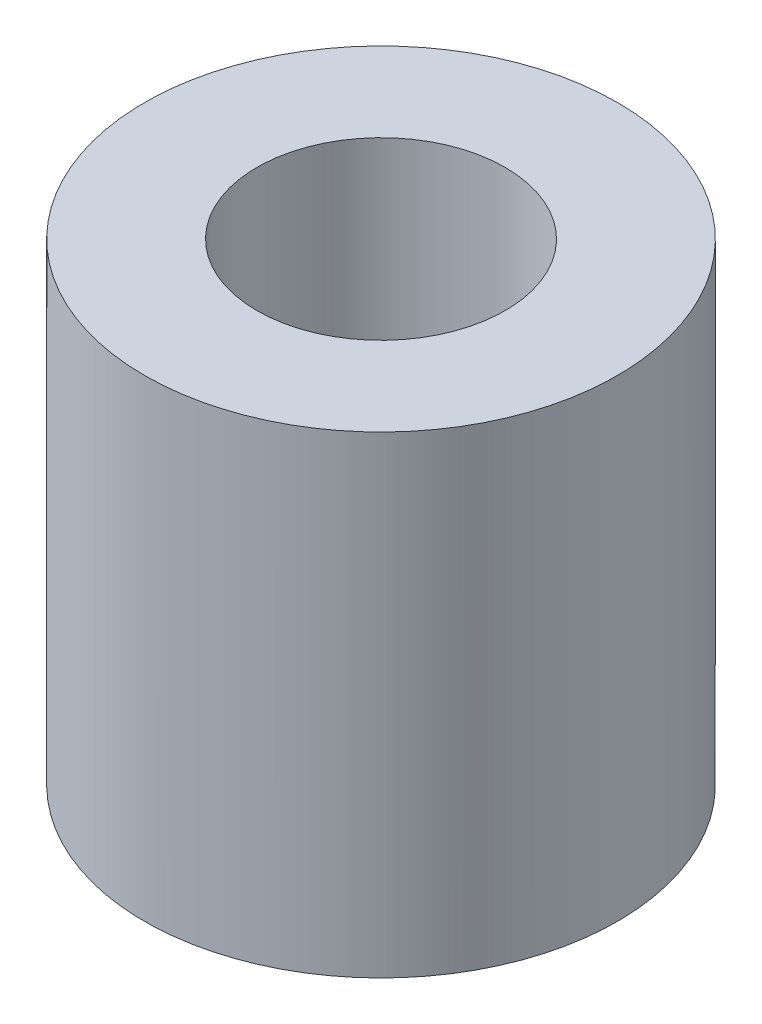
ISO-10303-21;
HEADER;
FILE_DESCRIPTION(('STEP AP214'),'2;1');
FILE_NAME('part.step','',(''),(''),'','','');
FILE_SCHEMA(('AUTOMOTIVE_DESIGN { 1 0 10303 214 1 1 1 1 }'));
ENDSEC;
DATA;
#1=APPLICATION_CONTEXT('core data for automotive mechanical design processes');
#2=APPLICATION_PROTOCOL_DEFINITION('international standard','automotive_design',2000,#1);
#3=PRODUCT_CONTEXT('',#1,'mechanical');
#4=PRODUCT('Part','Part','',(#3));
#5=PRODUCT_RELATED_PRODUCT_CATEGORY('part','',(#4));
#6=PRODUCT_DEFINITION_FORMATION('','',#4);
#7=PRODUCT_DEFINITION_CONTEXT('part definition',#1,'design');
#8=PRODUCT_DEFINITION('design','',#6,#7);
#9=PRODUCT_DEFINITION_SHAPE('','',#8);
#10=(LENGTH_UNIT() NAMED_UNIT(*) SI_UNIT(.MILLI.,.METRE.));
#11=(NAMED_UNIT(*) PLANE_ANGLE_UNIT() SI_UNIT($,.RADIAN.));
#12=(NAMED_UNIT(*) SI_UNIT($,.STERADIAN.) SOLID_ANGLE_UNIT());
#13=UNCERTAINTY_MEASURE_WITH_UNIT(LENGTH_MEASURE(1.E-05),#10,'distance_accuracy_value','');
#14=(GEOMETRIC_REPRESENTATION_CONTEXT(3) GLOBAL_UNCERTAINTY_ASSIGNED_CONTEXT((#13)) GLOBAL_UNIT_ASSIGNED_CONTEXT((#10,
#11,#12)) REPRESENTATION_CONTEXT('',''));
#15=CARTESIAN_POINT('',(0.,0.,0.));
#16=DIRECTION('',(0.,0.,1.));
#17=DIRECTION('',(1.,0.,0.));
#18=AXIS2_PLACEMENT_3D('',#15,#16,#17);
#19=CARTESIAN_POINT('',(0.,12.7,0.));
#20=DIRECTION('',(0.,1.,0.));
#21=DIRECTION('',(0.,0.,1.));
#22=AXIS2_PLACEMENT_3D('',#19,#20,#21);
#23=PLANE('',#22);
#24=CARTESIAN_POINT('',(0.,12.7,0.));
#25=DIRECTION('',(0.,1.,0.));
#26=DIRECTION('',(0.,0.,1.));
#27=AXIS2_PLACEMENT_3D('',#24,#25,#26);
#28=CIRCLE('',#27,7.62);
#29=CARTESIAN_POINT('',(0.,12.7,7.62));
#30=VERTEX_POINT('',#29);
#31=EDGE_CURVE('E10',#30,#30,#28,.T.);
#32=ORIENTED_EDGE('',*,*,#31,.T.);
#33=EDGE_LOOP('',(#32));
#34=FACE_BOUND('',#33,.T.);
#35=CARTESIAN_POINT('',(0.,12.7,0.));
#36=DIRECTION('',(0.,1.,0.));
#37=DIRECTION('',(0.,0.,1.));
#38=AXIS2_PLACEMENT_3D('',#35,#36,#37);
#39=CIRCLE('',#38,4.0005);
#40=CARTESIAN_POINT('',(0.,12.7,4.0005));
#41=VERTEX_POINT('',#40);
#42=EDGE_CURVE('E37',#41,#41,#39,.T.);
#43=ORIENTED_EDGE('',*,*,#42,.F.);
#44=EDGE_LOOP('',(#43));
#45=FACE_BOUND('',#44,.T.);
#46=ADVANCED_FACE('F30',(#34,#45),#23,.T.);
#47=CARTESIAN_POINT('',(0.,12.7,0.));
#48=DIRECTION('',(0.,-1.,0.));
#49=DIRECTION('',(0.,0.,-1.));
#50=AXIS2_PLACEMENT_3D('',#47,#48,#49);
#51=CYLINDRICAL_SURFACE('',#50,7.62);
#52=ORIENTED_EDGE('',*,*,#31,.F.);
#53=EDGE_LOOP('',(#52));
#54=FACE_BOUND('',#53,.T.);
#55=CARTESIAN_POINT('',(0.,-2.54,0.));
#56=DIRECTION('',(0.,-1.,0.));
#57=DIRECTION('',(0.,0.,-1.));
#58=AXIS2_PLACEMENT_3D('',#55,#56,#57);
#59=CIRCLE('',#58,7.62);
#60=CARTESIAN_POINT('',(0.,-2.54,-7.62));
#61=VERTEX_POINT('',#60);
#62=EDGE_CURVE('E46',#61,#61,#59,.T.);
#63=ORIENTED_EDGE('',*,*,#62,.F.);
#64=EDGE_LOOP('',(#63));
#65=FACE_BOUND('',#64,.T.);
#66=ADVANCED_FACE('F32',(#54,#65),#51,.T.);
#67=CARTESIAN_POINT('',(0.,12.7,0.));
#68=DIRECTION('',(0.,-1.,0.));
#69=DIRECTION('',(0.,0.,-1.));
#70=AXIS2_PLACEMENT_3D('',#67,#68,#69);
#71=CYLINDRICAL_SURFACE('',#70,4.0005);
#72=ORIENTED_EDGE('',*,*,#42,.T.);
#73=EDGE_LOOP('',(#72));
#74=FACE_BOUND('',#73,.T.);
#75=CARTESIAN_POINT('',(0.,0.,0.));
#76=DIRECTION('',(0.,1.,0.));
#77=DIRECTION('',(0.,0.,1.));
#78=AXIS2_PLACEMENT_3D('',#75,#76,#77);
#79=CIRCLE('',#78,4.0005);
#80=CARTESIAN_POINT('',(0.,0.,4.0005));
#81=VERTEX_POINT('',#80);
#82=EDGE_CURVE('E41',#81,#81,#79,.T.);
#83=ORIENTED_EDGE('',*,*,#82,.F.);
#84=EDGE_LOOP('',(#83));
#85=FACE_BOUND('',#84,.T.);
#86=ADVANCED_FACE('F54',(#74,#85),#71,.F.);
#87=CARTESIAN_POINT('',(0.,0.,0.));
#88=DIRECTION('',(0.,-1.,0.));
#89=DIRECTION('',(0.,0.,-1.));
#90=AXIS2_PLACEMENT_3D('',#87,#88,#89);
#91=PLANE('',#90);
#92=ORIENTED_EDGE('',*,*,#82,.T.);
#93=EDGE_LOOP('',(#92));
#94=FACE_BOUND('',#93,.T.);
#95=ADVANCED_FACE('F60',(#94),#91,.F.);
#96=CARTESIAN_POINT('',(0.,-2.54,0.));
#97=DIRECTION('',(0.,-1.,0.));
#98=DIRECTION('',(0.,0.,-1.));
#99=AXIS2_PLACEMENT_3D('',#96,#97,#98);
#100=PLANE('',#99);
#101=ORIENTED_EDGE('',*,*,#62,.T.);
#102=EDGE_LOOP('',(#101));
#103=FACE_BOUND('',#102,.T.);
#104=ADVANCED_FACE('F51',(#103),#100,.T.);
#105=CLOSED_SHELL('',(#46,#66,#86,#95,#104));
#106=MANIFOLD_SOLID_BREP('B2',#105);
#107=ADVANCED_BREP_SHAPE_REPRESENTATION('',(#18,#106),#14);
#108=SHAPE_DEFINITION_REPRESENTATION(#9,#107);
ENDSEC;
END-ISO-10303-21;
